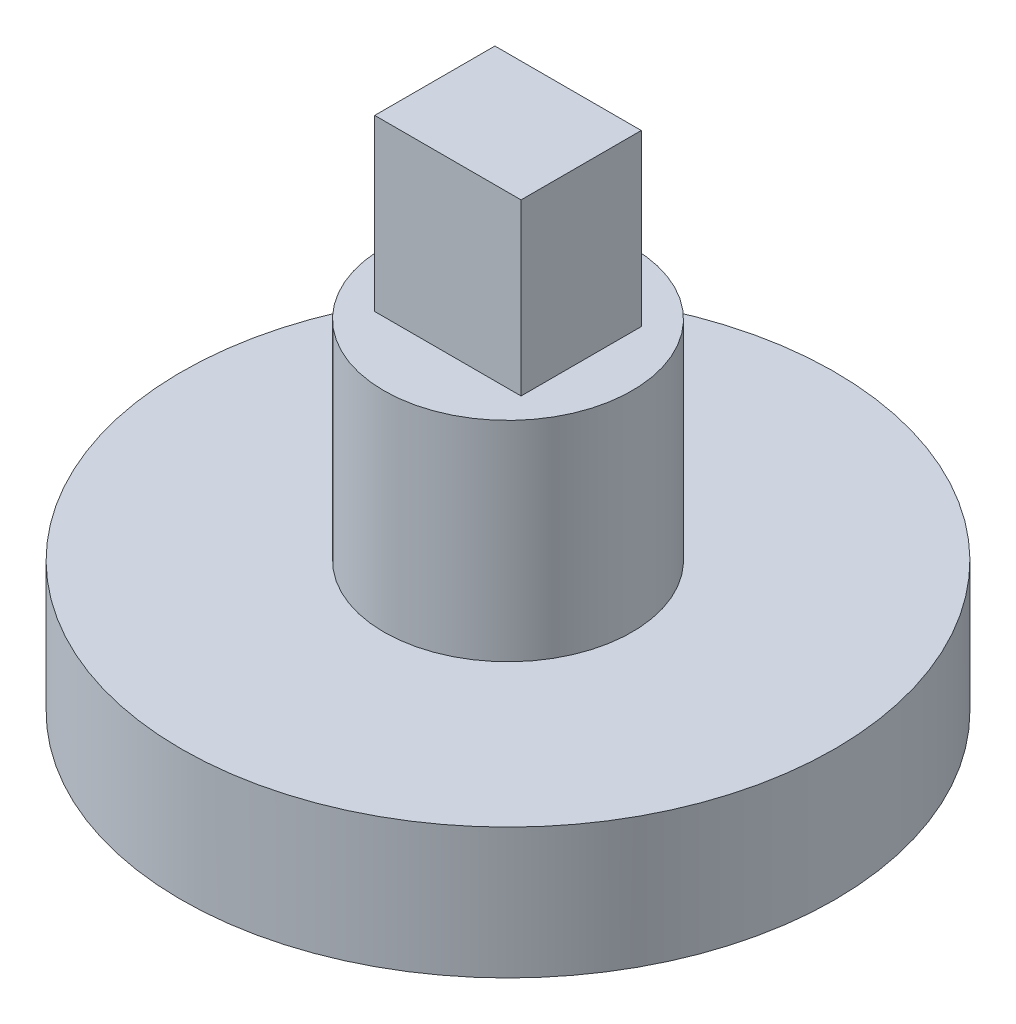
ISO-10303-21;
HEADER;
FILE_DESCRIPTION(('STEP AP214'),'2;1');
FILE_NAME('part.step','',(''),(''),'','','');
FILE_SCHEMA(('AUTOMOTIVE_DESIGN { 1 0 10303 214 1 1 1 1 }'));
ENDSEC;
DATA;
#1=APPLICATION_CONTEXT('core data for automotive mechanical design processes');
#2=APPLICATION_PROTOCOL_DEFINITION('international standard','automotive_design',2000,#1);
#3=PRODUCT_CONTEXT('',#1,'mechanical');
#4=PRODUCT('Part','Part','',(#3));
#5=PRODUCT_RELATED_PRODUCT_CATEGORY('part','',(#4));
#6=PRODUCT_DEFINITION_FORMATION('','',#4);
#7=PRODUCT_DEFINITION_CONTEXT('part definition',#1,'design');
#8=PRODUCT_DEFINITION('design','',#6,#7);
#9=PRODUCT_DEFINITION_SHAPE('','',#8);
#10=(LENGTH_UNIT() NAMED_UNIT(*) SI_UNIT(.MILLI.,.METRE.));
#11=(NAMED_UNIT(*) PLANE_ANGLE_UNIT() SI_UNIT($,.RADIAN.));
#12=(NAMED_UNIT(*) SI_UNIT($,.STERADIAN.) SOLID_ANGLE_UNIT());
#13=UNCERTAINTY_MEASURE_WITH_UNIT(LENGTH_MEASURE(1.E-05),#10,'distance_accuracy_value','');
#14=(GEOMETRIC_REPRESENTATION_CONTEXT(3) GLOBAL_UNCERTAINTY_ASSIGNED_CONTEXT((#13)) GLOBAL_UNIT_ASSIGNED_CONTEXT((#10,
#11,#12)) REPRESENTATION_CONTEXT('',''));
#15=CARTESIAN_POINT('',(0.,0.,0.));
#16=DIRECTION('',(0.,0.,1.));
#17=DIRECTION('',(1.,0.,0.));
#18=AXIS2_PLACEMENT_3D('',#15,#16,#17);
#19=CARTESIAN_POINT('',(0.,3.,0.));
#20=DIRECTION('',(0.,1.,0.));
#21=DIRECTION('',(0.,0.,1.));
#22=AXIS2_PLACEMENT_3D('',#19,#20,#21);
#23=PLANE('',#22);
#24=CARTESIAN_POINT('',(0.,3.,0.));
#25=DIRECTION('',(0.,1.,0.));
#26=DIRECTION('',(0.,0.,1.));
#27=AXIS2_PLACEMENT_3D('',#24,#25,#26);
#28=CIRCLE('',#27,3.5);
#29=CARTESIAN_POINT('',(-0.288199979171007,3.,3.48811421430059));
#30=VERTEX_POINT('',#29);
#31=CARTESIAN_POINT('',(-0.288199979171007,3.,-3.48811421430059));
#32=VERTEX_POINT('',#31);
#33=EDGE_CURVE('E11',#30,#32,#28,.F.);
#34=ORIENTED_EDGE('',*,*,#33,.F.);
#35=DIRECTION('',(-0.99660406122874,0.,-0.0823428511917162));
#36=VECTOR('',#35,1.);
#37=CARTESIAN_POINT('',(-0.288199979171007,3.,3.48811421430059));
#38=LINE('',#37,#36);
#39=CARTESIAN_POINT('',(-12.2474487139159,3.,2.5));
#40=VERTEX_POINT('',#39);
#41=EDGE_CURVE('E109',#30,#40,#38,.T.);
#42=ORIENTED_EDGE('',*,*,#41,.T.);
#43=CARTESIAN_POINT('',(0.,3.,0.));
#44=DIRECTION('',(0.,1.,0.));
#45=DIRECTION('',(0.,0.,1.));
#46=AXIS2_PLACEMENT_3D('',#43,#44,#45);
#47=CIRCLE('',#46,12.5);
#48=CARTESIAN_POINT('',(-12.2474487139159,3.,-2.5));
#49=VERTEX_POINT('',#48);
#50=EDGE_CURVE('E134',#49,#40,#47,.T.);
#51=ORIENTED_EDGE('',*,*,#50,.F.);
#52=DIRECTION('',(-0.99660406122874,0.,0.0823428511917161));
#53=VECTOR('',#52,1.);
#54=CARTESIAN_POINT('',(-0.288199979171006,3.,-3.48811421430059));
#55=LINE('',#54,#53);
#56=EDGE_CURVE('E111',#32,#49,#55,.T.);
#57=ORIENTED_EDGE('',*,*,#56,.F.);
#58=EDGE_LOOP('',(#34,#42,#51,#57));
#59=FACE_BOUND('',#58,.T.);
#60=ADVANCED_FACE('F39',(#59),#23,.F.);
#61=CARTESIAN_POINT('',(0.,5.,0.));
#62=DIRECTION('',(0.,-1.,0.));
#63=DIRECTION('',(0.,0.,-1.));
#64=AXIS2_PLACEMENT_3D('',#61,#62,#63);
#65=CYLINDRICAL_SURFACE('',#64,12.5);
#66=ORIENTED_EDGE('',*,*,#50,.T.);
#67=DIRECTION('',(0.,-1.,0.));
#68=VECTOR('',#67,1.);
#69=CARTESIAN_POINT('',(-12.2474487139159,3.,2.5));
#70=LINE('',#69,#68);
#71=CARTESIAN_POINT('',(-12.2474487139159,0.,2.5));
#72=VERTEX_POINT('',#71);
#73=EDGE_CURVE('E128',#40,#72,#70,.T.);
#74=ORIENTED_EDGE('',*,*,#73,.T.);
#75=CARTESIAN_POINT('',(0.,0.,0.));
#76=DIRECTION('',(0.,1.,0.));
#77=DIRECTION('',(0.,0.,1.));
#78=AXIS2_PLACEMENT_3D('',#75,#76,#77);
#79=CIRCLE('',#78,12.5);
#80=CARTESIAN_POINT('',(-12.2474487139159,0.,-2.5));
#81=VERTEX_POINT('',#80);
#82=EDGE_CURVE('E197',#72,#81,#79,.T.);
#83=ORIENTED_EDGE('',*,*,#82,.T.);
#84=DIRECTION('',(0.,-1.,0.));
#85=VECTOR('',#84,1.);
#86=CARTESIAN_POINT('',(-12.2474487139159,3.,-2.5));
#87=LINE('',#86,#85);
#88=EDGE_CURVE('E55',#49,#81,#87,.T.);
#89=ORIENTED_EDGE('',*,*,#88,.F.);
#90=EDGE_LOOP('',(#66,#74,#83,#89));
#91=FACE_BOUND('',#90,.T.);
#92=CARTESIAN_POINT('',(0.,5.,0.));
#93=DIRECTION('',(0.,1.,0.));
#94=DIRECTION('',(0.,0.,1.));
#95=AXIS2_PLACEMENT_3D('',#92,#93,#94);
#96=CIRCLE('',#95,12.5);
#97=CARTESIAN_POINT('',(0.,5.,12.5));
#98=VERTEX_POINT('',#97);
#99=EDGE_CURVE('E48',#98,#98,#96,.T.);
#100=ORIENTED_EDGE('',*,*,#99,.F.);
#101=EDGE_LOOP('',(#100));
#102=FACE_BOUND('',#101,.T.);
#103=ADVANCED_FACE('F41',(#91,#102),#65,.T.);
#104=CARTESIAN_POINT('',(0.,5.,0.));
#105=DIRECTION('',(0.,1.,0.));
#106=DIRECTION('',(0.,0.,1.));
#107=AXIS2_PLACEMENT_3D('',#104,#105,#106);
#108=PLANE('',#107);
#109=CARTESIAN_POINT('',(0.,5.,0.));
#110=DIRECTION('',(0.,1.,0.));
#111=DIRECTION('',(0.,0.,1.));
#112=AXIS2_PLACEMENT_3D('',#109,#110,#111);
#113=CIRCLE('',#112,4.75);
#114=CARTESIAN_POINT('',(0.,5.,4.75));
#115=VERTEX_POINT('',#114);
#116=EDGE_CURVE('E198',#115,#115,#113,.T.);
#117=ORIENTED_EDGE('',*,*,#116,.F.);
#118=EDGE_LOOP('',(#117));
#119=FACE_BOUND('',#118,.T.);
#120=ORIENTED_EDGE('',*,*,#99,.T.);
#121=EDGE_LOOP('',(#120));
#122=FACE_BOUND('',#121,.T.);
#123=ADVANCED_FACE('F227',(#119,#122),#108,.T.);
#124=CARTESIAN_POINT('',(0.,0.,0.));
#125=DIRECTION('',(0.,1.,0.));
#126=DIRECTION('',(0.,0.,1.));
#127=AXIS2_PLACEMENT_3D('',#124,#125,#126);
#128=PLANE('',#127);
#129=ORIENTED_EDGE('',*,*,#82,.F.);
#130=DIRECTION('',(-0.99660406122874,0.,-0.0823428511917162));
#131=VECTOR('',#130,1.);
#132=CARTESIAN_POINT('',(-0.288199979171007,0.,3.48811421430059));
#133=LINE('',#132,#131);
#134=CARTESIAN_POINT('',(-0.288199979171006,0.,3.48811421430059));
#135=VERTEX_POINT('',#134);
#136=EDGE_CURVE('E142',#135,#72,#133,.T.);
#137=ORIENTED_EDGE('',*,*,#136,.F.);
#138=CARTESIAN_POINT('',(0.,0.,0.));
#139=DIRECTION('',(0.,1.,0.));
#140=DIRECTION('',(0.,0.,1.));
#141=AXIS2_PLACEMENT_3D('',#138,#139,#140);
#142=CIRCLE('',#141,3.5);
#143=CARTESIAN_POINT('',(-0.288199979171007,0.,-3.48811421430059));
#144=VERTEX_POINT('',#143);
#145=EDGE_CURVE('E119',#135,#144,#142,.T.);
#146=ORIENTED_EDGE('',*,*,#145,.T.);
#147=DIRECTION('',(-0.99660406122874,0.,0.0823428511917161));
#148=VECTOR('',#147,1.);
#149=CARTESIAN_POINT('',(-0.288199979171006,0.,-3.48811421430059));
#150=LINE('',#149,#148);
#151=EDGE_CURVE('E130',#144,#81,#150,.T.);
#152=ORIENTED_EDGE('',*,*,#151,.T.);
#153=EDGE_LOOP('',(#129,#137,#146,#152));
#154=FACE_BOUND('',#153,.T.);
#155=ADVANCED_FACE('F210',(#154),#128,.F.);
#156=CARTESIAN_POINT('',(0.,13.,0.));
#157=DIRECTION('',(0.,-1.,0.));
#158=DIRECTION('',(0.,0.,-1.));
#159=AXIS2_PLACEMENT_3D('',#156,#157,#158);
#160=CYLINDRICAL_SURFACE('',#159,4.75);
#161=ORIENTED_EDGE('',*,*,#116,.T.);
#162=EDGE_LOOP('',(#161));
#163=FACE_BOUND('',#162,.T.);
#164=CARTESIAN_POINT('',(0.,13.,0.));
#165=DIRECTION('',(0.,1.,0.));
#166=DIRECTION('',(0.,0.,1.));
#167=AXIS2_PLACEMENT_3D('',#164,#165,#166);
#168=CIRCLE('',#167,4.75);
#169=CARTESIAN_POINT('',(0.,13.,4.75));
#170=VERTEX_POINT('',#169);
#171=EDGE_CURVE('E193',#170,#170,#168,.T.);
#172=ORIENTED_EDGE('',*,*,#171,.F.);
#173=EDGE_LOOP('',(#172));
#174=FACE_BOUND('',#173,.T.);
#175=ADVANCED_FACE('F236',(#163,#174),#160,.T.);
#176=CARTESIAN_POINT('',(0.,13.,0.));
#177=DIRECTION('',(0.,1.,0.));
#178=DIRECTION('',(0.,0.,1.));
#179=AXIS2_PLACEMENT_3D('',#176,#177,#178);
#180=PLANE('',#179);
#181=DIRECTION('',(1.,0.,0.));
#182=VECTOR('',#181,1.);
#183=CARTESIAN_POINT('',(0.,13.,2.3));
#184=LINE('',#183,#182);
#185=CARTESIAN_POINT('',(-2.8,13.,2.3));
#186=VERTEX_POINT('',#185);
#187=CARTESIAN_POINT('',(2.8,13.,2.3));
#188=VERTEX_POINT('',#187);
#189=EDGE_CURVE('E179',#186,#188,#184,.T.);
#190=ORIENTED_EDGE('',*,*,#189,.F.);
#191=DIRECTION('',(0.,0.,-1.));
#192=VECTOR('',#191,1.);
#193=CARTESIAN_POINT('',(-2.8,13.,0.));
#194=LINE('',#193,#192);
#195=CARTESIAN_POINT('',(-2.8,13.,-2.3));
#196=VERTEX_POINT('',#195);
#197=EDGE_CURVE('E182',#186,#196,#194,.T.);
#198=ORIENTED_EDGE('',*,*,#197,.T.);
#199=DIRECTION('',(1.,0.,0.));
#200=VECTOR('',#199,1.);
#201=CARTESIAN_POINT('',(0.,13.,-2.3));
#202=LINE('',#201,#200);
#203=CARTESIAN_POINT('',(2.8,13.,-2.3));
#204=VERTEX_POINT('',#203);
#205=EDGE_CURVE('E186',#196,#204,#202,.T.);
#206=ORIENTED_EDGE('',*,*,#205,.T.);
#207=DIRECTION('',(0.,0.,-1.));
#208=VECTOR('',#207,1.);
#209=CARTESIAN_POINT('',(2.8,13.,0.));
#210=LINE('',#209,#208);
#211=EDGE_CURVE('E190',#188,#204,#210,.T.);
#212=ORIENTED_EDGE('',*,*,#211,.F.);
#213=EDGE_LOOP('',(#190,#198,#206,#212));
#214=FACE_BOUND('',#213,.T.);
#215=ORIENTED_EDGE('',*,*,#171,.T.);
#216=EDGE_LOOP('',(#215));
#217=FACE_BOUND('',#216,.T.);
#218=ADVANCED_FACE('F242',(#214,#217),#180,.T.);
#219=CARTESIAN_POINT('',(0.,19.5,0.));
#220=DIRECTION('',(0.,1.,0.));
#221=DIRECTION('',(0.,0.,1.));
#222=AXIS2_PLACEMENT_3D('',#219,#220,#221);
#223=PLANE('',#222);
#224=DIRECTION('',(0.,0.,-1.));
#225=VECTOR('',#224,1.);
#226=CARTESIAN_POINT('',(-2.8,19.5,0.));
#227=LINE('',#226,#225);
#228=CARTESIAN_POINT('',(-2.8,19.5,2.3));
#229=VERTEX_POINT('',#228);
#230=CARTESIAN_POINT('',(-2.8,19.5,-2.3));
#231=VERTEX_POINT('',#230);
#232=EDGE_CURVE('E123',#229,#231,#227,.T.);
#233=ORIENTED_EDGE('',*,*,#232,.F.);
#234=DIRECTION('',(1.,0.,0.));
#235=VECTOR('',#234,1.);
#236=CARTESIAN_POINT('',(0.,19.5,2.3));
#237=LINE('',#236,#235);
#238=CARTESIAN_POINT('',(2.8,19.5,2.3));
#239=VERTEX_POINT('',#238);
#240=EDGE_CURVE('E156',#229,#239,#237,.T.);
#241=ORIENTED_EDGE('',*,*,#240,.T.);
#242=DIRECTION('',(0.,0.,-1.));
#243=VECTOR('',#242,1.);
#244=CARTESIAN_POINT('',(2.8,19.5,0.));
#245=LINE('',#244,#243);
#246=CARTESIAN_POINT('',(2.8,19.5,-2.3));
#247=VERTEX_POINT('',#246);
#248=EDGE_CURVE('E159',#239,#247,#245,.T.);
#249=ORIENTED_EDGE('',*,*,#248,.T.);
#250=DIRECTION('',(1.,0.,0.));
#251=VECTOR('',#250,1.);
#252=CARTESIAN_POINT('',(0.,19.5,-2.3));
#253=LINE('',#252,#251);
#254=EDGE_CURVE('E162',#231,#247,#253,.T.);
#255=ORIENTED_EDGE('',*,*,#254,.F.);
#256=EDGE_LOOP('',(#233,#241,#249,#255));
#257=FACE_BOUND('',#256,.T.);
#258=ADVANCED_FACE('F246',(#257),#223,.T.);
#259=CARTESIAN_POINT('',(0.,19.5,-2.3));
#260=DIRECTION('',(0.,0.,-1.));
#261=DIRECTION('',(-1.,0.,0.));
#262=AXIS2_PLACEMENT_3D('',#259,#260,#261);
#263=PLANE('',#262);
#264=DIRECTION('',(0.,-1.,0.));
#265=VECTOR('',#264,1.);
#266=CARTESIAN_POINT('',(2.8,19.5,-2.3));
#267=LINE('',#266,#265);
#268=EDGE_CURVE('E63',#247,#204,#267,.T.);
#269=ORIENTED_EDGE('',*,*,#268,.T.);
#270=ORIENTED_EDGE('',*,*,#205,.F.);
#271=DIRECTION('',(0.,-1.,0.));
#272=VECTOR('',#271,1.);
#273=CARTESIAN_POINT('',(-2.8,19.5,-2.3));
#274=LINE('',#273,#272);
#275=EDGE_CURVE('E165',#231,#196,#274,.T.);
#276=ORIENTED_EDGE('',*,*,#275,.F.);
#277=ORIENTED_EDGE('',*,*,#254,.T.);
#278=EDGE_LOOP('',(#269,#270,#276,#277));
#279=FACE_BOUND('',#278,.T.);
#280=ADVANCED_FACE('F259',(#279),#263,.T.);
#281=CARTESIAN_POINT('',(2.8,19.5,0.));
#282=DIRECTION('',(-1.,0.,0.));
#283=DIRECTION('',(0.,0.,1.));
#284=AXIS2_PLACEMENT_3D('',#281,#282,#283);
#285=PLANE('',#284);
#286=ORIENTED_EDGE('',*,*,#211,.T.);
#287=ORIENTED_EDGE('',*,*,#268,.F.);
#288=ORIENTED_EDGE('',*,*,#248,.F.);
#289=DIRECTION('',(0.,-1.,0.));
#290=VECTOR('',#289,1.);
#291=CARTESIAN_POINT('',(2.8,19.5,2.3));
#292=LINE('',#291,#290);
#293=EDGE_CURVE('E171',#239,#188,#292,.T.);
#294=ORIENTED_EDGE('',*,*,#293,.T.);
#295=EDGE_LOOP('',(#286,#287,#288,#294));
#296=FACE_BOUND('',#295,.T.);
#297=ADVANCED_FACE('F255',(#296),#285,.F.);
#298=CARTESIAN_POINT('',(0.,19.5,2.3));
#299=DIRECTION('',(0.,0.,-1.));
#300=DIRECTION('',(-1.,0.,0.));
#301=AXIS2_PLACEMENT_3D('',#298,#299,#300);
#302=PLANE('',#301);
#303=ORIENTED_EDGE('',*,*,#189,.T.);
#304=ORIENTED_EDGE('',*,*,#293,.F.);
#305=ORIENTED_EDGE('',*,*,#240,.F.);
#306=DIRECTION('',(0.,-1.,0.));
#307=VECTOR('',#306,1.);
#308=CARTESIAN_POINT('',(-2.8,19.5,2.3));
#309=LINE('',#308,#307);
#310=EDGE_CURVE('E175',#229,#186,#309,.T.);
#311=ORIENTED_EDGE('',*,*,#310,.T.);
#312=EDGE_LOOP('',(#303,#304,#305,#311));
#313=FACE_BOUND('',#312,.T.);
#314=ADVANCED_FACE('F251',(#313),#302,.F.);
#315=CARTESIAN_POINT('',(-2.8,19.5,0.));
#316=DIRECTION('',(-1.,0.,0.));
#317=DIRECTION('',(0.,0.,1.));
#318=AXIS2_PLACEMENT_3D('',#315,#316,#317);
#319=PLANE('',#318);
#320=ORIENTED_EDGE('',*,*,#275,.T.);
#321=ORIENTED_EDGE('',*,*,#197,.F.);
#322=ORIENTED_EDGE('',*,*,#310,.F.);
#323=ORIENTED_EDGE('',*,*,#232,.T.);
#324=EDGE_LOOP('',(#320,#321,#322,#323));
#325=FACE_BOUND('',#324,.T.);
#326=ADVANCED_FACE('F248',(#325),#319,.T.);
#327=CARTESIAN_POINT('',(-0.288199979171007,3.,3.48811421430059));
#328=DIRECTION('',(-0.0823428511917162,0.,0.99660406122874));
#329=DIRECTION('',(0.99660406122874,0.,0.0823428511917162));
#330=AXIS2_PLACEMENT_3D('',#327,#328,#329);
#331=PLANE('',#330);
#332=ORIENTED_EDGE('',*,*,#136,.T.);
#333=ORIENTED_EDGE('',*,*,#73,.F.);
#334=ORIENTED_EDGE('',*,*,#41,.F.);
#335=DIRECTION('',(0.,-1.,0.));
#336=VECTOR('',#335,1.);
#337=CARTESIAN_POINT('',(-0.288199979171006,3.,3.48811421430059));
#338=LINE('',#337,#336);
#339=EDGE_CURVE('E115',#30,#135,#338,.T.);
#340=ORIENTED_EDGE('',*,*,#339,.T.);
#341=EDGE_LOOP('',(#332,#333,#334,#340));
#342=FACE_BOUND('',#341,.T.);
#343=ADVANCED_FACE('F126',(#342),#331,.F.);
#344=CARTESIAN_POINT('',(0.,3.,0.));
#345=DIRECTION('',(0.,-1.,0.));
#346=DIRECTION('',(0.,0.,-1.));
#347=AXIS2_PLACEMENT_3D('',#344,#345,#346);
#348=CYLINDRICAL_SURFACE('',#347,3.5);
#349=ORIENTED_EDGE('',*,*,#145,.F.);
#350=ORIENTED_EDGE('',*,*,#339,.F.);
#351=ORIENTED_EDGE('',*,*,#33,.T.);
#352=DIRECTION('',(0.,-1.,0.));
#353=VECTOR('',#352,1.);
#354=CARTESIAN_POINT('',(-0.288199979171007,3.,-3.48811421430059));
#355=LINE('',#354,#353);
#356=EDGE_CURVE('E124',#32,#144,#355,.T.);
#357=ORIENTED_EDGE('',*,*,#356,.T.);
#358=EDGE_LOOP('',(#349,#350,#351,#357));
#359=FACE_BOUND('',#358,.T.);
#360=CARTESIAN_POINT('',(0.,4.,0.));
#361=DIRECTION('',(0.,1.,0.));
#362=DIRECTION('',(0.,0.,1.));
#363=AXIS2_PLACEMENT_3D('',#360,#361,#362);
#364=CIRCLE('',#363,3.5);
#365=CARTESIAN_POINT('',(0.,4.,3.5));
#366=VERTEX_POINT('',#365);
#367=EDGE_CURVE('E138',#366,#366,#364,.T.);
#368=ORIENTED_EDGE('',*,*,#367,.T.);
#369=EDGE_LOOP('',(#368));
#370=FACE_BOUND('',#369,.T.);
#371=ADVANCED_FACE('F116',(#359,#370),#348,.F.);
#372=CARTESIAN_POINT('',(-0.288199979171006,3.,-3.48811421430059));
#373=DIRECTION('',(0.0823428511917161,0.,0.99660406122874));
#374=DIRECTION('',(0.99660406122874,0.,-0.0823428511917161));
#375=AXIS2_PLACEMENT_3D('',#372,#373,#374);
#376=PLANE('',#375);
#377=ORIENTED_EDGE('',*,*,#151,.F.);
#378=ORIENTED_EDGE('',*,*,#356,.F.);
#379=ORIENTED_EDGE('',*,*,#56,.T.);
#380=ORIENTED_EDGE('',*,*,#88,.T.);
#381=EDGE_LOOP('',(#377,#378,#379,#380));
#382=FACE_BOUND('',#381,.T.);
#383=ADVANCED_FACE('F211',(#382),#376,.T.);
#384=CARTESIAN_POINT('',(0.,4.,0.));
#385=DIRECTION('',(0.,1.,0.));
#386=DIRECTION('',(0.,0.,1.));
#387=AXIS2_PLACEMENT_3D('',#384,#385,#386);
#388=PLANE('',#387);
#389=ORIENTED_EDGE('',*,*,#367,.F.);
#390=EDGE_LOOP('',(#389));
#391=FACE_BOUND('',#390,.T.);
#392=ADVANCED_FACE('F213',(#391),#388,.F.);
#393=CLOSED_SHELL('',(#60,#103,#123,#155,#175,#218,#258,#280,#297,#314,#326,#343,#371,#383,#392));
#394=MANIFOLD_SOLID_BREP('B2',#393);
#395=ADVANCED_BREP_SHAPE_REPRESENTATION('',(#18,#394),#14);
#396=SHAPE_DEFINITION_REPRESENTATION(#9,#395);
ENDSEC;
END-ISO-10303-21;
